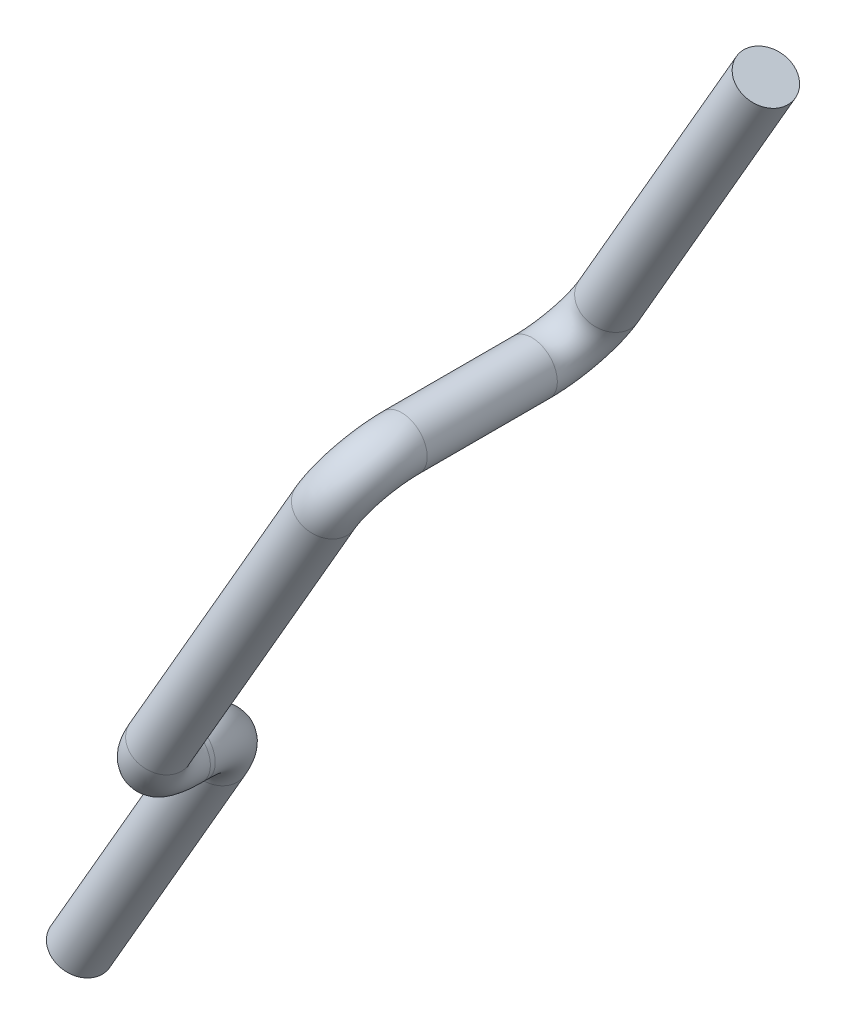
ISO-10303-21;
HEADER;
FILE_DESCRIPTION(('STEP AP214'),'2;1');
FILE_NAME('part.step','',(''),(''),'','','');
FILE_SCHEMA(('AUTOMOTIVE_DESIGN { 1 0 10303 214 1 1 1 1 }'));
ENDSEC;
DATA;
#1=APPLICATION_CONTEXT('core data for automotive mechanical design processes');
#2=APPLICATION_PROTOCOL_DEFINITION('international standard','automotive_design',2000,#1);
#3=PRODUCT_CONTEXT('',#1,'mechanical');
#4=PRODUCT('Part','Part','',(#3));
#5=PRODUCT_RELATED_PRODUCT_CATEGORY('part','',(#4));
#6=PRODUCT_DEFINITION_FORMATION('','',#4);
#7=PRODUCT_DEFINITION_CONTEXT('part definition',#1,'design');
#8=PRODUCT_DEFINITION('design','',#6,#7);
#9=PRODUCT_DEFINITION_SHAPE('','',#8);
#10=(LENGTH_UNIT() NAMED_UNIT(*) SI_UNIT(.MILLI.,.METRE.));
#11=(NAMED_UNIT(*) PLANE_ANGLE_UNIT() SI_UNIT($,.RADIAN.));
#12=(NAMED_UNIT(*) SI_UNIT($,.STERADIAN.) SOLID_ANGLE_UNIT());
#13=UNCERTAINTY_MEASURE_WITH_UNIT(LENGTH_MEASURE(1.E-05),#10,'distance_accuracy_value','');
#14=(GEOMETRIC_REPRESENTATION_CONTEXT(3) GLOBAL_UNCERTAINTY_ASSIGNED_CONTEXT((#13)) GLOBAL_UNIT_ASSIGNED_CONTEXT((#10,
#11,#12)) REPRESENTATION_CONTEXT('',''));
#15=CARTESIAN_POINT('',(0.,0.,0.));
#16=DIRECTION('',(0.,0.,1.));
#17=DIRECTION('',(1.,0.,0.));
#18=AXIS2_PLACEMENT_3D('',#15,#16,#17);
#19=CARTESIAN_POINT('',(-4.78701969818021,197.266545463351,40.924916794942));
#20=DIRECTION('',(0.5,0.866025403784438,0.));
#21=DIRECTION('',(0.866025403784439,-0.5,0.));
#22=AXIS2_PLACEMENT_3D('',#19,#20,#21);
#23=CYLINDRICAL_SURFACE('',#22,0.78125);
#24=CARTESIAN_POINT('',(-4.78701969818021,197.266545463351,40.924916794942));
#25=DIRECTION('',(-0.5,-0.866025403784439,0.));
#26=DIRECTION('',(-0.866025403784439,0.5,0.));
#27=AXIS2_PLACEMENT_3D('',#24,#25,#26);
#28=CIRCLE('',#27,0.78125);
#29=CARTESIAN_POINT('',(-4.78701969818021,197.266545463351,40.143666794942));
#30=VERTEX_POINT('',#29);
#31=EDGE_CURVE('E21',#30,#30,#28,.T.);
#32=ORIENTED_EDGE('',*,*,#31,.F.);
#33=EDGE_LOOP('',(#32));
#34=FACE_BOUND('',#33,.T.);
#35=CARTESIAN_POINT('',(0.0368293680057982,205.621697134029,40.924916794942));
#36=DIRECTION('',(-0.5,-0.866025403784439,0.));
#37=DIRECTION('',(-0.866025403784439,0.5,0.));
#38=AXIS2_PLACEMENT_3D('',#35,#36,#37);
#39=CIRCLE('',#38,0.78125);
#40=CARTESIAN_POINT('',(-0.639752978700795,206.012322134029,40.924916794942));
#41=VERTEX_POINT('',#40);
#42=EDGE_CURVE('E10',#41,#41,#39,.T.);
#43=ORIENTED_EDGE('',*,*,#42,.T.);
#44=EDGE_LOOP('',(#43));
#45=FACE_BOUND('',#44,.T.);
#46=ADVANCED_FACE('F14',(#34,#45),#23,.T.);
#47=CARTESIAN_POINT('',(-4.78701969818021,197.266545463351,42.487416794942));
#48=DIRECTION('',(0.866025403784439,-0.5,0.));
#49=DIRECTION('',(-0.5,-0.866025403784438,0.));
#50=AXIS2_PLACEMENT_3D('',#47,#48,#49);
#51=TOROIDAL_SURFACE('',#50,1.5625,0.78125);
#52=CARTESIAN_POINT('',(-5.56826969818016,195.913380769938,42.487416794942));
#53=DIRECTION('',(0.,0.,1.));
#54=DIRECTION('',(-0.866025403784438,0.5,0.));
#55=AXIS2_PLACEMENT_3D('',#52,#53,#54);
#56=CIRCLE('',#55,0.78125);
#57=CARTESIAN_POINT('',(-5.95889469818028,195.236798423231,42.487416794942));
#58=VERTEX_POINT('',#57);
#59=EDGE_CURVE('E28',#58,#58,#56,.T.);
#60=CARTESIAN_POINT('',(-4.78701969818021,197.266545463351,42.487416794942));
#61=DIRECTION('',(0.866025403784439,-0.5,0.));
#62=DIRECTION('',(-0.5,-0.866025403784438,0.));
#63=AXIS2_PLACEMENT_3D('',#60,#61,#62);
#64=CIRCLE('',#63,2.34375);
#65=EDGE_CURVE('',#58,#30,#64,.T.);
#66=ORIENTED_EDGE('',*,*,#59,.F.);
#67=ORIENTED_EDGE('',*,*,#31,.T.);
#68=ORIENTED_EDGE('',*,*,#65,.T.);
#69=ORIENTED_EDGE('',*,*,#65,.F.);
#70=EDGE_LOOP('',(#66,#68,#67,#69));
#71=FACE_BOUND('',#70,.T.);
#72=ADVANCED_FACE('F102',(#71),#51,.T.);
#73=CARTESIAN_POINT('',(-5.56826969818021,195.913380769938,46.47274108256));
#74=DIRECTION('',(0.,0.,-1.));
#75=DIRECTION('',(-1.,0.,0.));
#76=AXIS2_PLACEMENT_3D('',#73,#74,#75);
#77=CYLINDRICAL_SURFACE('',#76,0.78125);
#78=CARTESIAN_POINT('',(-5.56826969818021,195.913380769938,46.47274108256));
#79=DIRECTION('',(0.,0.,1.));
#80=DIRECTION('',(-0.866025403784438,0.5,0.));
#81=AXIS2_PLACEMENT_3D('',#78,#79,#80);
#82=CIRCLE('',#81,0.78125);
#83=CARTESIAN_POINT('',(-5.17764469818009,196.589963116645,46.47274108256));
#84=VERTEX_POINT('',#83);
#85=EDGE_CURVE('E34',#84,#84,#82,.T.);
#86=ORIENTED_EDGE('',*,*,#85,.F.);
#87=EDGE_LOOP('',(#86));
#88=FACE_BOUND('',#87,.T.);
#89=ORIENTED_EDGE('',*,*,#59,.T.);
#90=EDGE_LOOP('',(#89));
#91=FACE_BOUND('',#90,.T.);
#92=ADVANCED_FACE('F96',(#88,#91),#77,.T.);
#93=CARTESIAN_POINT('',(-6.34951969818016,194.560216076525,46.47274108256));
#94=DIRECTION('',(-0.866025403784439,0.5,0.));
#95=DIRECTION('',(0.5,0.866025403784438,0.));
#96=AXIS2_PLACEMENT_3D('',#93,#94,#95);
#97=TOROIDAL_SURFACE('',#96,1.5625,0.78125);
#98=CARTESIAN_POINT('',(-6.34951969818021,194.560216076525,48.03524108256));
#99=DIRECTION('',(-0.5,-0.866025403784439,0.));
#100=DIRECTION('',(-0.866025403784439,0.5,0.));
#101=AXIS2_PLACEMENT_3D('',#98,#99,#100);
#102=CIRCLE('',#101,0.78125);
#103=CARTESIAN_POINT('',(-6.34951969818024,194.560216076525,48.81649108256));
#104=VERTEX_POINT('',#103);
#105=EDGE_CURVE('E40',#104,#104,#102,.T.);
#106=CARTESIAN_POINT('',(-6.34951969818016,194.560216076525,46.47274108256));
#107=DIRECTION('',(-0.866025403784439,0.5,0.));
#108=DIRECTION('',(0.5,0.866025403784438,0.));
#109=AXIS2_PLACEMENT_3D('',#106,#107,#108);
#110=CIRCLE('',#109,2.34375);
#111=EDGE_CURVE('',#104,#84,#110,.T.);
#112=ORIENTED_EDGE('',*,*,#105,.F.);
#113=ORIENTED_EDGE('',*,*,#85,.T.);
#114=ORIENTED_EDGE('',*,*,#111,.T.);
#115=ORIENTED_EDGE('',*,*,#111,.F.);
#116=EDGE_LOOP('',(#112,#114,#113,#115));
#117=FACE_BOUND('',#116,.T.);
#118=ADVANCED_FACE('F90',(#117),#97,.T.);
#119=CARTESIAN_POINT('',(-11.4276094169007,185.764706678308,48.03524108256));
#120=DIRECTION('',(0.5,0.866025403784438,0.));
#121=DIRECTION('',(0.866025403784439,-0.5,0.));
#122=AXIS2_PLACEMENT_3D('',#119,#120,#121);
#123=CYLINDRICAL_SURFACE('',#122,0.78125);
#124=CARTESIAN_POINT('',(-11.4276094169007,185.764706678308,48.03524108256));
#125=DIRECTION('',(-0.5,-0.866025403784439,0.));
#126=DIRECTION('',(-0.866025403784439,0.5,0.));
#127=AXIS2_PLACEMENT_3D('',#124,#125,#126);
#128=CIRCLE('',#127,0.78125);
#129=CARTESIAN_POINT('',(-11.4276094169006,185.764706678308,48.81649108256));
#130=VERTEX_POINT('',#129);
#131=EDGE_CURVE('E44',#130,#130,#128,.T.);
#132=ORIENTED_EDGE('',*,*,#131,.F.);
#133=EDGE_LOOP('',(#132));
#134=FACE_BOUND('',#133,.T.);
#135=ORIENTED_EDGE('',*,*,#105,.T.);
#136=EDGE_LOOP('',(#135));
#137=FACE_BOUND('',#136,.T.);
#138=ADVANCED_FACE('F84',(#134,#137),#123,.T.);
#139=CARTESIAN_POINT('',(-11.4276094169007,185.764706678308,46.47274108256));
#140=DIRECTION('',(-0.866025403784439,0.5,0.));
#141=DIRECTION('',(0.5,0.866025403784438,0.));
#142=AXIS2_PLACEMENT_3D('',#139,#140,#141);
#143=TOROIDAL_SURFACE('',#142,1.5625,0.78125);
#144=CARTESIAN_POINT('',(-12.2088594169007,184.411541984895,46.47274108256));
#145=DIRECTION('',(0.,0.,-1.));
#146=DIRECTION('',(-0.866025403784438,0.5,0.));
#147=AXIS2_PLACEMENT_3D('',#144,#145,#146);
#148=CIRCLE('',#147,0.78125);
#149=CARTESIAN_POINT('',(-12.5994844169005,183.734959638188,46.47274108256));
#150=VERTEX_POINT('',#149);
#151=EDGE_CURVE('E48',#150,#150,#148,.T.);
#152=CARTESIAN_POINT('',(-11.4276094169007,185.764706678308,46.47274108256));
#153=DIRECTION('',(-0.866025403784439,0.5,0.));
#154=DIRECTION('',(0.5,0.866025403784438,0.));
#155=AXIS2_PLACEMENT_3D('',#152,#153,#154);
#156=CIRCLE('',#155,2.34375);
#157=EDGE_CURVE('',#150,#130,#156,.T.);
#158=ORIENTED_EDGE('',*,*,#151,.F.);
#159=ORIENTED_EDGE('',*,*,#131,.T.);
#160=ORIENTED_EDGE('',*,*,#157,.T.);
#161=ORIENTED_EDGE('',*,*,#157,.F.);
#162=EDGE_LOOP('',(#158,#160,#159,#161));
#163=FACE_BOUND('',#162,.T.);
#164=ADVANCED_FACE('F78',(#163),#143,.T.);
#165=CARTESIAN_POINT('',(-12.2088594169007,184.411541984895,46.3233292870314));
#166=DIRECTION('',(0.,0.,1.));
#167=DIRECTION('',(0.,1.,0.));
#168=AXIS2_PLACEMENT_3D('',#165,#166,#167);
#169=CYLINDRICAL_SURFACE('',#168,0.78125);
#170=CARTESIAN_POINT('',(-12.2088594169007,184.411541984895,46.3233292870314));
#171=DIRECTION('',(0.,0.,-1.));
#172=DIRECTION('',(-0.866025403784438,0.5,0.));
#173=AXIS2_PLACEMENT_3D('',#170,#171,#172);
#174=CIRCLE('',#173,0.78125);
#175=CARTESIAN_POINT('',(-11.8182344169006,185.088124331601,46.3233292870314));
#176=VERTEX_POINT('',#175);
#177=EDGE_CURVE('E52',#176,#176,#174,.T.);
#178=ORIENTED_EDGE('',*,*,#177,.F.);
#179=EDGE_LOOP('',(#178));
#180=FACE_BOUND('',#179,.T.);
#181=ORIENTED_EDGE('',*,*,#151,.T.);
#182=EDGE_LOOP('',(#181));
#183=FACE_BOUND('',#182,.T.);
#184=ADVANCED_FACE('F72',(#180,#183),#169,.T.);
#185=CARTESIAN_POINT('',(-12.9901094169007,183.058377291481,46.3233292870314));
#186=DIRECTION('',(0.866025403784439,-0.5,0.));
#187=DIRECTION('',(-0.5,-0.866025403784438,0.));
#188=AXIS2_PLACEMENT_3D('',#185,#186,#187);
#189=TOROIDAL_SURFACE('',#188,1.5625,0.78125);
#190=CARTESIAN_POINT('',(-12.9901094169007,183.058377291481,44.7608292870314));
#191=DIRECTION('',(-0.5,-0.866025403784439,0.));
#192=DIRECTION('',(-0.866025403784439,0.5,0.));
#193=AXIS2_PLACEMENT_3D('',#190,#191,#192);
#194=CIRCLE('',#193,0.78125);
#195=CARTESIAN_POINT('',(-12.9901094169007,183.058377291481,43.9795792870314));
#196=VERTEX_POINT('',#195);
#197=EDGE_CURVE('E56',#196,#196,#194,.T.);
#198=CARTESIAN_POINT('',(-12.9901094169007,183.058377291481,46.3233292870314));
#199=DIRECTION('',(0.866025403784439,-0.5,0.));
#200=DIRECTION('',(-0.5,-0.866025403784438,0.));
#201=AXIS2_PLACEMENT_3D('',#198,#199,#200);
#202=CIRCLE('',#201,2.34375);
#203=EDGE_CURVE('',#196,#176,#202,.T.);
#204=ORIENTED_EDGE('',*,*,#197,.F.);
#205=ORIENTED_EDGE('',*,*,#177,.T.);
#206=ORIENTED_EDGE('',*,*,#203,.T.);
#207=ORIENTED_EDGE('',*,*,#203,.F.);
#208=EDGE_LOOP('',(#204,#206,#205,#207));
#209=FACE_BOUND('',#208,.T.);
#210=ADVANCED_FACE('F69',(#209),#189,.T.);
#211=CARTESIAN_POINT('',(-12.9901094169007,183.058377291481,44.7608292870314));
#212=DIRECTION('',(-0.5,-0.866025403784438,0.));
#213=DIRECTION('',(-0.866025403784439,0.5,0.));
#214=AXIS2_PLACEMENT_3D('',#211,#212,#213);
#215=CYLINDRICAL_SURFACE('',#214,0.78125);
#216=ORIENTED_EDGE('',*,*,#197,.T.);
#217=EDGE_LOOP('',(#216));
#218=FACE_BOUND('',#217,.T.);
#219=CARTESIAN_POINT('',(-17.1279982020854,175.891343679472,44.7608292870314));
#220=DIRECTION('',(-0.5,-0.866025403784439,0.));
#221=DIRECTION('',(-0.866025403784439,0.5,0.));
#222=AXIS2_PLACEMENT_3D('',#219,#220,#221);
#223=CIRCLE('',#222,0.78125);
#224=CARTESIAN_POINT('',(-17.804580548792,176.281968679472,44.7608292870314));
#225=VERTEX_POINT('',#224);
#226=EDGE_CURVE('E57',#225,#225,#223,.T.);
#227=ORIENTED_EDGE('',*,*,#226,.F.);
#228=EDGE_LOOP('',(#227));
#229=FACE_BOUND('',#228,.T.);
#230=ADVANCED_FACE('F66',(#218,#229),#215,.T.);
#231=CARTESIAN_POINT('',(0.0368293680057982,205.621697134029,40.924916794942));
#232=DIRECTION('',(-0.5,-0.86602540378444,0.));
#233=DIRECTION('',(-0.866025403784441,0.5,0.));
#234=AXIS2_PLACEMENT_3D('',#231,#232,#233);
#235=PLANE('',#234);
#236=ORIENTED_EDGE('',*,*,#42,.F.);
#237=EDGE_LOOP('',(#236));
#238=FACE_BOUND('',#237,.T.);
#239=ADVANCED_FACE('F115',(#238),#235,.F.);
#240=CARTESIAN_POINT('',(-17.1279982020854,175.891343679472,44.7608292870314));
#241=DIRECTION('',(-0.5,-0.866025403784439,0.));
#242=DIRECTION('',(-0.866025403784439,0.5,0.));
#243=AXIS2_PLACEMENT_3D('',#240,#241,#242);
#244=PLANE('',#243);
#245=ORIENTED_EDGE('',*,*,#226,.T.);
#246=EDGE_LOOP('',(#245));
#247=FACE_BOUND('',#246,.T.);
#248=ADVANCED_FACE('F116',(#247),#244,.T.);
#249=CLOSED_SHELL('',(#46,#72,#92,#118,#138,#164,#184,#210,#230,#239,#248));
#250=MANIFOLD_SOLID_BREP('B1',#249);
#251=ADVANCED_BREP_SHAPE_REPRESENTATION('',(#18,#250),#14);
#252=SHAPE_DEFINITION_REPRESENTATION(#9,#251);
ENDSEC;
END-ISO-10303-21;
